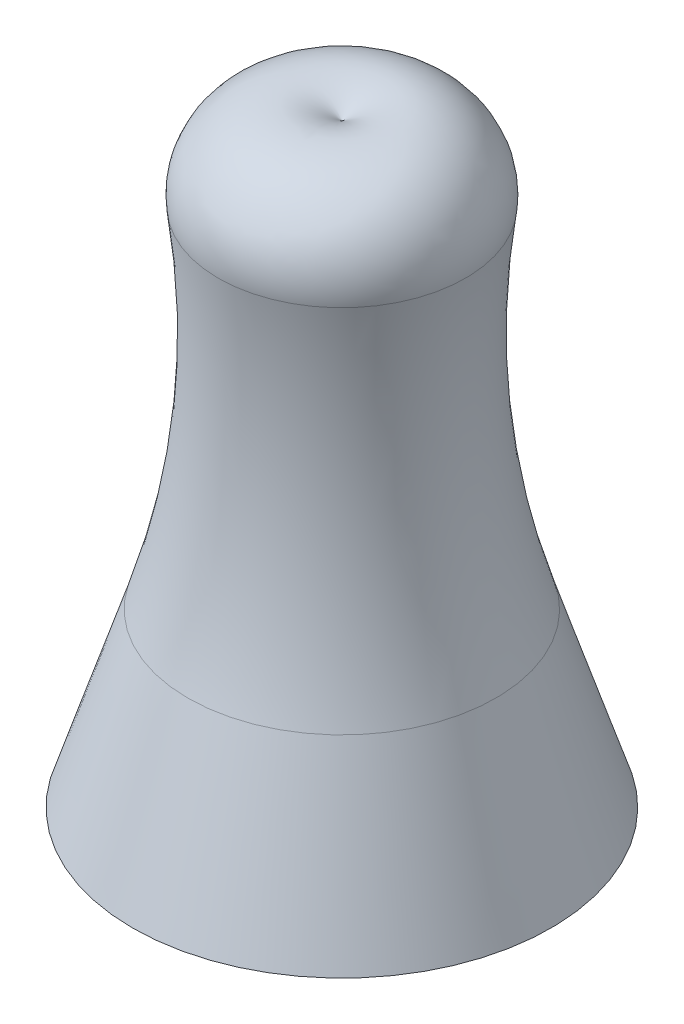
ISO-10303-21;
HEADER;
FILE_DESCRIPTION(('STEP AP214'),'2;1');
FILE_NAME('part.step','',(''),(''),'','','');
FILE_SCHEMA(('AUTOMOTIVE_DESIGN { 1 0 10303 214 1 1 1 1 }'));
ENDSEC;
DATA;
#1=APPLICATION_CONTEXT('core data for automotive mechanical design processes');
#2=APPLICATION_PROTOCOL_DEFINITION('international standard','automotive_design',2000,#1);
#3=PRODUCT_CONTEXT('',#1,'mechanical');
#4=PRODUCT('Part','Part','',(#3));
#5=PRODUCT_RELATED_PRODUCT_CATEGORY('part','',(#4));
#6=PRODUCT_DEFINITION_FORMATION('','',#4);
#7=PRODUCT_DEFINITION_CONTEXT('part definition',#1,'design');
#8=PRODUCT_DEFINITION('design','',#6,#7);
#9=PRODUCT_DEFINITION_SHAPE('','',#8);
#10=(LENGTH_UNIT() NAMED_UNIT(*) SI_UNIT(.MILLI.,.METRE.));
#11=(NAMED_UNIT(*) PLANE_ANGLE_UNIT() SI_UNIT($,.RADIAN.));
#12=(NAMED_UNIT(*) SI_UNIT($,.STERADIAN.) SOLID_ANGLE_UNIT());
#13=UNCERTAINTY_MEASURE_WITH_UNIT(LENGTH_MEASURE(1.E-05),#10,'distance_accuracy_value','');
#14=(GEOMETRIC_REPRESENTATION_CONTEXT(3) GLOBAL_UNCERTAINTY_ASSIGNED_CONTEXT((#13)) GLOBAL_UNIT_ASSIGNED_CONTEXT((#10,
#11,#12)) REPRESENTATION_CONTEXT('',''));
#15=CARTESIAN_POINT('',(0.,0.,0.));
#16=DIRECTION('',(0.,0.,1.));
#17=DIRECTION('',(1.,0.,0.));
#18=AXIS2_PLACEMENT_3D('',#15,#16,#17);
#19=CARTESIAN_POINT('',(-14.3198651337589,-2.4297989990032,1.75956722646311));
#20=DIRECTION('',(-1.,0.,0.));
#21=DIRECTION('',(0.,0.,1.));
#22=AXIS2_PLACEMENT_3D('',#19,#20,#21);
#23=CIRCLE('',#22,3.);
#24=TRIMMED_CURVE('',#23,(PARAMETER_VALUE(-2.19755478064828)),
(PARAMETER_VALUE(2.19755478064828)),.T.,.PARAMETER.);
#25=CARTESIAN_POINT('',(-14.3198651337589,-2.4297989990032,0.));
#26=DIRECTION('',(0.,1.,0.));
#27=AXIS1_PLACEMENT('',#25,#26);
#28=SURFACE_OF_REVOLUTION('',#24,#27);
#29=CARTESIAN_POINT('',(-14.3198651337589,0.,0.));
#30=VERTEX_POINT('',#29);
#31=VERTEX_LOOP('',#30);
#32=FACE_BOUND('',#31,.T.);
#33=CARTESIAN_POINT('',(-14.3198651337589,-2.84324724189427,0.));
#34=DIRECTION('',(0.,1.,0.));
#35=DIRECTION('',(0.,0.,1.));
#36=AXIS2_PLACEMENT_3D('',#33,#34,#35);
#37=CIRCLE('',#36,4.73094073890651);
#38=CARTESIAN_POINT('',(-14.3198651337589,-2.84324724189427,4.73094073890651));
#39=VERTEX_POINT('',#38);
#40=EDGE_CURVE('E11',#39,#39,#37,.T.);
#41=ORIENTED_EDGE('',*,*,#40,.T.);
#42=EDGE_LOOP('',(#41));
#43=FACE_BOUND('',#42,.T.);
#44=ADVANCED_FACE('F33',(#32,#43),#28,.T.);
#45=CARTESIAN_POINT('',(-14.3198651337589,-6.97772967080499,0.));
#46=DIRECTION('',(0.,1.,0.));
#47=DIRECTION('',(0.,0.,1.));
#48=AXIS2_PLACEMENT_3D('',#45,#46,#47);
#49=TOROIDAL_SURFACE('',#48,34.4446758633406,30.);
#50=ORIENTED_EDGE('',*,*,#40,.F.);
#51=EDGE_LOOP('',(#50));
#52=FACE_BOUND('',#51,.T.);
#53=CARTESIAN_POINT('',(-14.3198651337589,-16.1718665747374,0.));
#54=DIRECTION('',(0.,1.,0.));
#55=DIRECTION('',(0.,0.,1.));
#56=AXIS2_PLACEMENT_3D('',#53,#54,#55);
#57=CIRCLE('',#56,5.88827821602264);
#58=CARTESIAN_POINT('',(-14.3198651337589,-16.1718665747374,5.88827821602264));
#59=VERTEX_POINT('',#58);
#60=EDGE_CURVE('E39',#59,#59,#57,.T.);
#61=ORIENTED_EDGE('',*,*,#60,.T.);
#62=EDGE_LOOP('',(#61));
#63=FACE_BOUND('',#62,.T.);
#64=ADVANCED_FACE('F44',(#52,#63),#49,.F.);
#65=CARTESIAN_POINT('',(-14.3198651337589,-22.7307385617283,0.));
#66=DIRECTION('',(0.,-1.,0.));
#67=DIRECTION('',(0.,0.,-1.));
#68=AXIS2_PLACEMENT_3D('',#65,#66,#67);
#69=CONICAL_SURFACE('',#68,8.,0.311483650268053);
#70=ORIENTED_EDGE('',*,*,#60,.F.);
#71=EDGE_LOOP('',(#70));
#72=FACE_BOUND('',#71,.T.);
#73=CARTESIAN_POINT('',(-14.3198651337589,-22.7307385617283,0.));
#74=DIRECTION('',(0.,1.,0.));
#75=DIRECTION('',(0.,0.,1.));
#76=AXIS2_PLACEMENT_3D('',#73,#74,#75);
#77=CIRCLE('',#76,8.);
#78=CARTESIAN_POINT('',(-14.3198651337589,-22.7307385617283,8.));
#79=VERTEX_POINT('',#78);
#80=EDGE_CURVE('E53',#79,#79,#77,.T.);
#81=ORIENTED_EDGE('',*,*,#80,.T.);
#82=EDGE_LOOP('',(#81));
#83=FACE_BOUND('',#82,.T.);
#84=ADVANCED_FACE('F49',(#72,#83),#69,.T.);
#85=CARTESIAN_POINT('',(-6.31986513375891,-22.7307385617283,0.));
#86=DIRECTION('',(0.,1.,0.));
#87=DIRECTION('',(0.,0.,1.));
#88=AXIS2_PLACEMENT_3D('',#85,#86,#87);
#89=PLANE('',#88);
#90=CARTESIAN_POINT('',(-14.3198651337589,-22.7307385617283,0.));
#91=DIRECTION('',(0.,-1.,0.));
#92=DIRECTION('',(1.,0.,0.));
#93=AXIS2_PLACEMENT_3D('',#90,#91,#92);
#94=CIRCLE('',#93,2.);
#95=CARTESIAN_POINT('',(-12.3198651337589,-22.7307385617283,0.));
#96=VERTEX_POINT('',#95);
#97=EDGE_CURVE('E58',#96,#96,#94,.T.);
#98=ORIENTED_EDGE('',*,*,#97,.F.);
#99=EDGE_LOOP('',(#98));
#100=FACE_BOUND('',#99,.T.);
#101=ORIENTED_EDGE('',*,*,#80,.F.);
#102=EDGE_LOOP('',(#101));
#103=FACE_BOUND('',#102,.T.);
#104=ADVANCED_FACE('F69',(#100,#103),#89,.F.);
#105=CARTESIAN_POINT('',(-14.3198651337589,-12.7307385617283,0.));
#106=DIRECTION('',(0.,-1.,0.));
#107=DIRECTION('',(1.,0.,0.));
#108=AXIS2_PLACEMENT_3D('',#105,#106,#107);
#109=CYLINDRICAL_SURFACE('',#108,2.);
#110=CARTESIAN_POINT('',(-14.3198651337589,-12.7307385617283,0.));
#111=DIRECTION('',(0.,-1.,0.));
#112=DIRECTION('',(1.,0.,0.));
#113=AXIS2_PLACEMENT_3D('',#110,#111,#112);
#114=CIRCLE('',#113,2.);
#115=CARTESIAN_POINT('',(-12.3198651337589,-12.7307385617283,0.));
#116=VERTEX_POINT('',#115);
#117=EDGE_CURVE('E55',#116,#116,#114,.T.);
#118=ORIENTED_EDGE('',*,*,#117,.F.);
#119=EDGE_LOOP('',(#118));
#120=FACE_BOUND('',#119,.T.);
#121=ORIENTED_EDGE('',*,*,#97,.T.);
#122=EDGE_LOOP('',(#121));
#123=FACE_BOUND('',#122,.T.);
#124=ADVANCED_FACE('F66',(#120,#123),#109,.F.);
#125=CARTESIAN_POINT('',(-14.3198651337589,-12.7307385617283,0.));
#126=DIRECTION('',(0.,-1.,0.));
#127=DIRECTION('',(1.,0.,0.));
#128=AXIS2_PLACEMENT_3D('',#125,#126,#127);
#129=PLANE('',#128);
#130=ORIENTED_EDGE('',*,*,#117,.T.);
#131=EDGE_LOOP('',(#130));
#132=FACE_BOUND('',#131,.T.);
#133=ADVANCED_FACE('F64',(#132),#129,.T.);
#134=CLOSED_SHELL('',(#44,#64,#84,#104,#124,#133));
#135=MANIFOLD_SOLID_BREP('B2',#134);
#136=ADVANCED_BREP_SHAPE_REPRESENTATION('',(#18,#135),#14);
#137=SHAPE_DEFINITION_REPRESENTATION(#9,#136);
ENDSEC;
END-ISO-10303-21;
